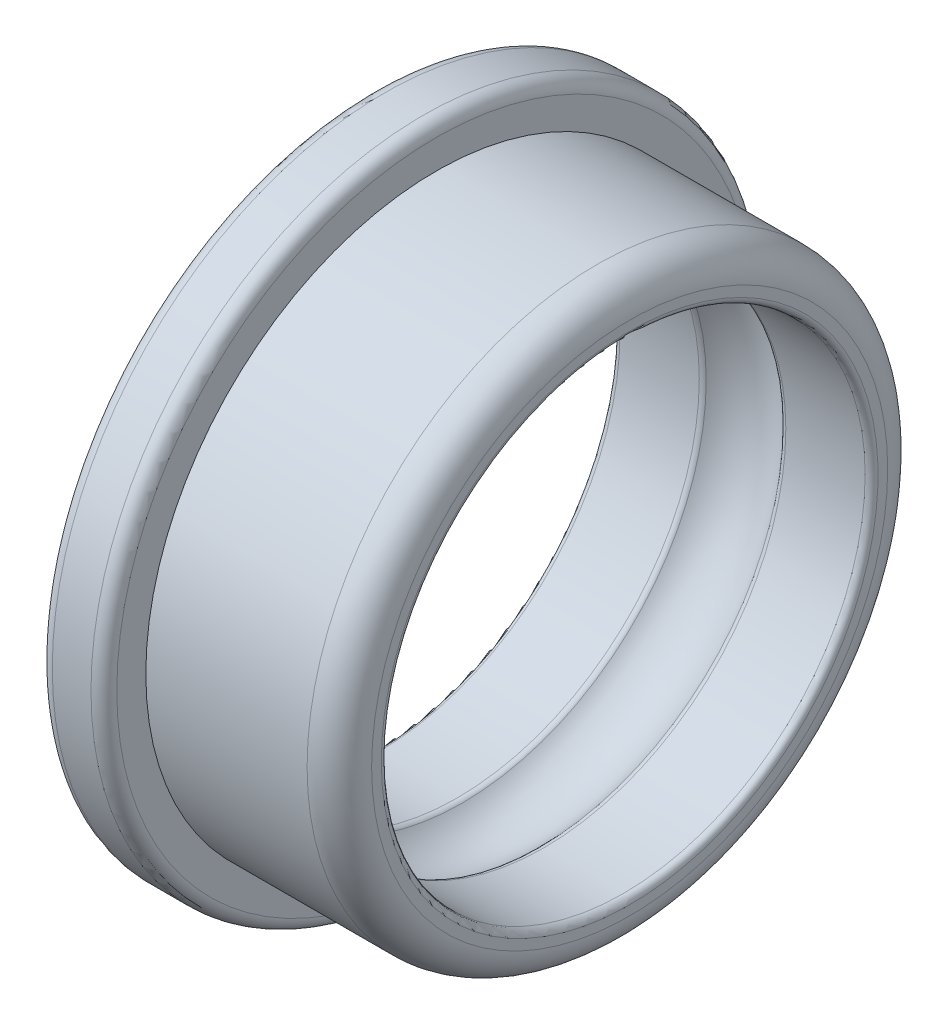
ISO-10303-21;
HEADER;
FILE_DESCRIPTION(('STEP AP214'),'2;1');
FILE_NAME('part.step','',(''),(''),'','','');
FILE_SCHEMA(('AUTOMOTIVE_DESIGN { 1 0 10303 214 1 1 1 1 }'));
ENDSEC;
DATA;
#1=APPLICATION_CONTEXT('core data for automotive mechanical design processes');
#2=APPLICATION_PROTOCOL_DEFINITION('international standard','automotive_design',2000,#1);
#3=PRODUCT_CONTEXT('',#1,'mechanical');
#4=PRODUCT('Part','Part','',(#3));
#5=PRODUCT_RELATED_PRODUCT_CATEGORY('part','',(#4));
#6=PRODUCT_DEFINITION_FORMATION('','',#4);
#7=PRODUCT_DEFINITION_CONTEXT('part definition',#1,'design');
#8=PRODUCT_DEFINITION('design','',#6,#7);
#9=PRODUCT_DEFINITION_SHAPE('','',#8);
#10=(LENGTH_UNIT() NAMED_UNIT(*) SI_UNIT(.MILLI.,.METRE.));
#11=(NAMED_UNIT(*) PLANE_ANGLE_UNIT() SI_UNIT($,.RADIAN.));
#12=(NAMED_UNIT(*) SI_UNIT($,.STERADIAN.) SOLID_ANGLE_UNIT());
#13=UNCERTAINTY_MEASURE_WITH_UNIT(LENGTH_MEASURE(1.E-05),#10,'distance_accuracy_value','');
#14=(GEOMETRIC_REPRESENTATION_CONTEXT(3) GLOBAL_UNCERTAINTY_ASSIGNED_CONTEXT((#13)) GLOBAL_UNIT_ASSIGNED_CONTEXT((#10,
#11,#12)) REPRESENTATION_CONTEXT('',''));
#15=CARTESIAN_POINT('',(0.,0.,0.));
#16=DIRECTION('',(0.,0.,1.));
#17=DIRECTION('',(1.,0.,0.));
#18=AXIS2_PLACEMENT_3D('',#15,#16,#17);
#19=CARTESIAN_POINT('',(-9.85856409676789,0.,0.));
#20=DIRECTION('',(-1.,0.,0.));
#21=DIRECTION('',(0.,0.,1.));
#22=AXIS2_PLACEMENT_3D('',#19,#20,#21);
#23=CYLINDRICAL_SURFACE('',#22,3.75);
#24=CARTESIAN_POINT('',(-2.51823685224447,0.,0.));
#25=DIRECTION('',(1.,0.,0.));
#26=DIRECTION('',(0.,0.,-1.));
#27=AXIS2_PLACEMENT_3D('',#24,#25,#26);
#28=CIRCLE('',#27,3.75);
#29=CARTESIAN_POINT('',(-2.51823685224447,0.,-3.75));
#30=VERTEX_POINT('',#29);
#31=EDGE_CURVE('E77',#30,#30,#28,.F.);
#32=ORIENTED_EDGE('',*,*,#31,.T.);
#33=EDGE_LOOP('',(#32));
#34=FACE_BOUND('',#33,.T.);
#35=CARTESIAN_POINT('',(-1.2890572454944,0.,0.));
#36=DIRECTION('',(-1.,0.,0.));
#37=DIRECTION('',(0.,0.,1.));
#38=AXIS2_PLACEMENT_3D('',#35,#36,#37);
#39=CIRCLE('',#38,3.75);
#40=CARTESIAN_POINT('',(-1.2890572454944,0.,3.75));
#41=VERTEX_POINT('',#40);
#42=EDGE_CURVE('E80',#41,#41,#39,.F.);
#43=ORIENTED_EDGE('',*,*,#42,.T.);
#44=EDGE_LOOP('',(#43));
#45=FACE_BOUND('',#44,.T.);
#46=ADVANCED_FACE('F39',(#34,#45),#23,.F.);
#47=CARTESIAN_POINT('',(-3.1890572454944,0.,0.));
#48=DIRECTION('',(-1.,0.,0.));
#49=DIRECTION('',(0.,0.,1.));
#50=AXIS2_PLACEMENT_3D('',#47,#48,#49);
#51=TOROIDAL_SURFACE('',#50,3.25,0.8);
#52=CARTESIAN_POINT('',(-2.59277245149445,0.,0.));
#53=DIRECTION('',(-1.,0.,0.));
#54=DIRECTION('',(0.,0.,1.));
#55=AXIS2_PLACEMENT_3D('',#52,#53,#54);
#56=CIRCLE('',#55,3.78333333333334);
#57=CARTESIAN_POINT('',(-2.59277245149445,0.,3.78333333333334));
#58=VERTEX_POINT('',#57);
#59=EDGE_CURVE('E71',#58,#58,#56,.F.);
#60=ORIENTED_EDGE('',*,*,#59,.T.);
#61=EDGE_LOOP('',(#60));
#62=FACE_BOUND('',#61,.T.);
#63=CARTESIAN_POINT('',(-3.78534203949435,0.,0.));
#64=DIRECTION('',(1.,0.,0.));
#65=DIRECTION('',(0.,0.,-1.));
#66=AXIS2_PLACEMENT_3D('',#63,#64,#65);
#67=CIRCLE('',#66,3.78333333333334);
#68=CARTESIAN_POINT('',(-3.78534203949435,0.,-3.78333333333334));
#69=VERTEX_POINT('',#68);
#70=EDGE_CURVE('E74',#69,#69,#67,.F.);
#71=ORIENTED_EDGE('',*,*,#70,.T.);
#72=EDGE_LOOP('',(#71));
#73=FACE_BOUND('',#72,.T.);
#74=ADVANCED_FACE('F110',(#62,#73),#51,.F.);
#75=CARTESIAN_POINT('',(-9.85856409676789,0.,0.));
#76=DIRECTION('',(-1.,0.,0.));
#77=DIRECTION('',(0.,0.,1.));
#78=AXIS2_PLACEMENT_3D('',#75,#76,#77);
#79=CYLINDRICAL_SURFACE('',#78,3.75);
#80=CARTESIAN_POINT('',(-5.0890572454944,0.,0.));
#81=DIRECTION('',(1.,0.,0.));
#82=DIRECTION('',(0.,0.,-1.));
#83=AXIS2_PLACEMENT_3D('',#80,#81,#82);
#84=CIRCLE('',#83,3.75);
#85=CARTESIAN_POINT('',(-5.0890572454944,0.,-3.75));
#86=VERTEX_POINT('',#85);
#87=EDGE_CURVE('E62',#86,#86,#84,.F.);
#88=ORIENTED_EDGE('',*,*,#87,.T.);
#89=EDGE_LOOP('',(#88));
#90=FACE_BOUND('',#89,.T.);
#91=CARTESIAN_POINT('',(-3.85987763874434,0.,0.));
#92=DIRECTION('',(1.,0.,0.));
#93=DIRECTION('',(0.,0.,-1.));
#94=AXIS2_PLACEMENT_3D('',#91,#92,#93);
#95=CIRCLE('',#94,3.75);
#96=CARTESIAN_POINT('',(-3.85987763874434,0.,-3.75));
#97=VERTEX_POINT('',#96);
#98=EDGE_CURVE('E65',#97,#97,#95,.T.);
#99=ORIENTED_EDGE('',*,*,#98,.T.);
#100=EDGE_LOOP('',(#99));
#101=FACE_BOUND('',#100,.T.);
#102=ADVANCED_FACE('F116',(#90,#101),#79,.F.);
#103=CARTESIAN_POINT('',(-5.1890572454944,4.50000000000001,0.));
#104=DIRECTION('',(1.,0.,0.));
#105=DIRECTION('',(0.,0.,-1.));
#106=AXIS2_PLACEMENT_3D('',#103,#104,#105);
#107=PLANE('',#106);
#108=CARTESIAN_POINT('',(-5.1890572454944,0.,0.));
#109=DIRECTION('',(1.,0.,0.));
#110=DIRECTION('',(0.,0.,-1.));
#111=AXIS2_PLACEMENT_3D('',#108,#109,#110);
#112=CIRCLE('',#111,4.95);
#113=CARTESIAN_POINT('',(-5.1890572454944,0.,-4.95));
#114=VERTEX_POINT('',#113);
#115=EDGE_CURVE('E10',#114,#114,#112,.F.);
#116=ORIENTED_EDGE('',*,*,#115,.T.);
#117=EDGE_LOOP('',(#116));
#118=FACE_BOUND('',#117,.T.);
#119=CARTESIAN_POINT('',(-5.1890572454944,0.,0.));
#120=DIRECTION('',(1.,0.,0.));
#121=DIRECTION('',(0.,0.,-1.));
#122=AXIS2_PLACEMENT_3D('',#119,#120,#121);
#123=CIRCLE('',#122,3.85);
#124=CARTESIAN_POINT('',(-5.1890572454944,0.,-3.85));
#125=VERTEX_POINT('',#124);
#126=EDGE_CURVE('E59',#125,#125,#123,.T.);
#127=ORIENTED_EDGE('',*,*,#126,.T.);
#128=EDGE_LOOP('',(#127));
#129=FACE_BOUND('',#128,.T.);
#130=ADVANCED_FACE('F152',(#118,#129),#107,.F.);
#131=CARTESIAN_POINT('',(-9.85856409676789,0.,0.));
#132=DIRECTION('',(-1.,0.,0.));
#133=DIRECTION('',(0.,0.,1.));
#134=AXIS2_PLACEMENT_3D('',#131,#132,#133);
#135=CYLINDRICAL_SURFACE('',#134,5.15);
#136=CARTESIAN_POINT('',(-4.3890572454944,0.,0.));
#137=DIRECTION('',(-1.,0.,0.));
#138=DIRECTION('',(0.,0.,1.));
#139=AXIS2_PLACEMENT_3D('',#136,#137,#138);
#140=CIRCLE('',#139,5.15);
#141=CARTESIAN_POINT('',(-4.3890572454944,0.,5.15));
#142=VERTEX_POINT('',#141);
#143=EDGE_CURVE('E50',#142,#142,#140,.T.);
#144=ORIENTED_EDGE('',*,*,#143,.T.);
#145=EDGE_LOOP('',(#144));
#146=FACE_BOUND('',#145,.T.);
#147=CARTESIAN_POINT('',(-4.9890572454944,0.,0.));
#148=DIRECTION('',(1.,0.,0.));
#149=DIRECTION('',(0.,0.,-1.));
#150=AXIS2_PLACEMENT_3D('',#147,#148,#149);
#151=CIRCLE('',#150,5.15);
#152=CARTESIAN_POINT('',(-4.9890572454944,0.,-5.15));
#153=VERTEX_POINT('',#152);
#154=EDGE_CURVE('E54',#153,#153,#151,.T.);
#155=ORIENTED_EDGE('',*,*,#154,.T.);
#156=EDGE_LOOP('',(#155));
#157=FACE_BOUND('',#156,.T.);
#158=ADVANCED_FACE('F107',(#146,#157),#135,.T.);
#159=CARTESIAN_POINT('',(-4.1890572454944,5.15000000000001,0.));
#160=DIRECTION('',(-1.,0.,0.));
#161=DIRECTION('',(0.,0.,1.));
#162=AXIS2_PLACEMENT_3D('',#159,#160,#161);
#163=PLANE('',#162);
#164=CARTESIAN_POINT('',(-4.1890572454944,0.,0.));
#165=DIRECTION('',(-1.,0.,0.));
#166=DIRECTION('',(0.,0.,1.));
#167=AXIS2_PLACEMENT_3D('',#164,#165,#166);
#168=CIRCLE('',#167,4.95);
#169=CARTESIAN_POINT('',(-4.1890572454944,0.,4.95));
#170=VERTEX_POINT('',#169);
#171=EDGE_CURVE('E46',#170,#170,#168,.F.);
#172=ORIENTED_EDGE('',*,*,#171,.T.);
#173=EDGE_LOOP('',(#172));
#174=FACE_BOUND('',#173,.T.);
#175=CARTESIAN_POINT('',(-4.1890572454944,0.,0.));
#176=DIRECTION('',(-1.,0.,0.));
#177=DIRECTION('',(0.,0.,1.));
#178=AXIS2_PLACEMENT_3D('',#175,#176,#177);
#179=CIRCLE('',#178,4.5);
#180=CARTESIAN_POINT('',(-4.1890572454944,0.,4.5));
#181=VERTEX_POINT('',#180);
#182=EDGE_CURVE('E89',#181,#181,#179,.T.);
#183=ORIENTED_EDGE('',*,*,#182,.T.);
#184=EDGE_LOOP('',(#183));
#185=FACE_BOUND('',#184,.T.);
#186=ADVANCED_FACE('F93',(#174,#185),#163,.F.);
#187=CARTESIAN_POINT('',(-9.85856409676789,0.,0.));
#188=DIRECTION('',(-1.,0.,0.));
#189=DIRECTION('',(0.,0.,1.));
#190=AXIS2_PLACEMENT_3D('',#187,#188,#189);
#191=CYLINDRICAL_SURFACE('',#190,4.5);
#192=CARTESIAN_POINT('',(-1.6890572454944,0.,0.));
#193=DIRECTION('',(-1.,0.,0.));
#194=DIRECTION('',(0.,0.,1.));
#195=AXIS2_PLACEMENT_3D('',#192,#193,#194);
#196=CIRCLE('',#195,4.5);
#197=CARTESIAN_POINT('',(-1.6890572454944,0.,4.5));
#198=VERTEX_POINT('',#197);
#199=EDGE_CURVE('E86',#198,#198,#196,.T.);
#200=ORIENTED_EDGE('',*,*,#199,.T.);
#201=EDGE_LOOP('',(#200));
#202=FACE_BOUND('',#201,.T.);
#203=ORIENTED_EDGE('',*,*,#182,.F.);
#204=EDGE_LOOP('',(#203));
#205=FACE_BOUND('',#204,.T.);
#206=ADVANCED_FACE('F95',(#202,#205),#191,.T.);
#207=CARTESIAN_POINT('',(-1.1890572454944,4.50000000000001,0.));
#208=DIRECTION('',(-1.,0.,0.));
#209=DIRECTION('',(0.,0.,1.));
#210=AXIS2_PLACEMENT_3D('',#207,#208,#209);
#211=PLANE('',#210);
#212=CARTESIAN_POINT('',(-1.1890572454944,0.,0.));
#213=DIRECTION('',(-1.,0.,0.));
#214=DIRECTION('',(0.,0.,1.));
#215=AXIS2_PLACEMENT_3D('',#212,#213,#214);
#216=CIRCLE('',#215,3.85);
#217=CARTESIAN_POINT('',(-1.1890572454944,0.,3.85));
#218=VERTEX_POINT('',#217);
#219=EDGE_CURVE('E68',#218,#218,#216,.T.);
#220=ORIENTED_EDGE('',*,*,#219,.T.);
#221=EDGE_LOOP('',(#220));
#222=FACE_BOUND('',#221,.T.);
#223=CARTESIAN_POINT('',(-1.1890572454944,0.,0.));
#224=DIRECTION('',(-1.,0.,0.));
#225=DIRECTION('',(0.,0.,1.));
#226=AXIS2_PLACEMENT_3D('',#223,#224,#225);
#227=CIRCLE('',#226,4.);
#228=CARTESIAN_POINT('',(-1.1890572454944,0.,4.));
#229=VERTEX_POINT('',#228);
#230=EDGE_CURVE('E83',#229,#229,#227,.F.);
#231=ORIENTED_EDGE('',*,*,#230,.T.);
#232=EDGE_LOOP('',(#231));
#233=FACE_BOUND('',#232,.T.);
#234=ADVANCED_FACE('F97',(#222,#233),#211,.F.);
#235=CARTESIAN_POINT('',(-1.6890572454944,0.,0.));
#236=DIRECTION('',(-1.,0.,0.));
#237=DIRECTION('',(0.,0.,1.));
#238=AXIS2_PLACEMENT_3D('',#235,#236,#237);
#239=TOROIDAL_SURFACE('',#238,4.,0.5);
#240=ORIENTED_EDGE('',*,*,#230,.F.);
#241=EDGE_LOOP('',(#240));
#242=FACE_BOUND('',#241,.T.);
#243=ORIENTED_EDGE('',*,*,#199,.F.);
#244=EDGE_LOOP('',(#243));
#245=FACE_BOUND('',#244,.T.);
#246=ADVANCED_FACE('F104',(#242,#245),#239,.T.);
#247=CARTESIAN_POINT('',(-2.51823685224447,0.,0.));
#248=DIRECTION('',(1.,0.,0.));
#249=DIRECTION('',(0.,0.,-1.));
#250=AXIS2_PLACEMENT_3D('',#247,#248,#249);
#251=TOROIDAL_SURFACE('',#250,3.85,0.1);
#252=ORIENTED_EDGE('',*,*,#59,.F.);
#253=EDGE_LOOP('',(#252));
#254=FACE_BOUND('',#253,.T.);
#255=ORIENTED_EDGE('',*,*,#31,.F.);
#256=EDGE_LOOP('',(#255));
#257=FACE_BOUND('',#256,.T.);
#258=ADVANCED_FACE('F124',(#254,#257),#251,.T.);
#259=CARTESIAN_POINT('',(-1.2890572454944,0.,0.));
#260=DIRECTION('',(-1.,0.,0.));
#261=DIRECTION('',(0.,0.,1.));
#262=AXIS2_PLACEMENT_3D('',#259,#260,#261);
#263=TOROIDAL_SURFACE('',#262,3.85,0.1);
#264=ORIENTED_EDGE('',*,*,#42,.F.);
#265=EDGE_LOOP('',(#264));
#266=FACE_BOUND('',#265,.T.);
#267=ORIENTED_EDGE('',*,*,#219,.F.);
#268=EDGE_LOOP('',(#267));
#269=FACE_BOUND('',#268,.T.);
#270=ADVANCED_FACE('F128',(#266,#269),#263,.T.);
#271=CARTESIAN_POINT('',(-5.0890572454944,0.,0.));
#272=DIRECTION('',(1.,0.,0.));
#273=DIRECTION('',(0.,0.,-1.));
#274=AXIS2_PLACEMENT_3D('',#271,#272,#273);
#275=TOROIDAL_SURFACE('',#274,3.85,0.1);
#276=ORIENTED_EDGE('',*,*,#126,.F.);
#277=EDGE_LOOP('',(#276));
#278=FACE_BOUND('',#277,.T.);
#279=ORIENTED_EDGE('',*,*,#87,.F.);
#280=EDGE_LOOP('',(#279));
#281=FACE_BOUND('',#280,.T.);
#282=ADVANCED_FACE('F132',(#278,#281),#275,.T.);
#283=CARTESIAN_POINT('',(-3.85987763874434,0.,0.));
#284=DIRECTION('',(1.,0.,0.));
#285=DIRECTION('',(0.,0.,-1.));
#286=AXIS2_PLACEMENT_3D('',#283,#284,#285);
#287=TOROIDAL_SURFACE('',#286,3.85,0.1);
#288=ORIENTED_EDGE('',*,*,#98,.F.);
#289=EDGE_LOOP('',(#288));
#290=FACE_BOUND('',#289,.T.);
#291=ORIENTED_EDGE('',*,*,#70,.F.);
#292=EDGE_LOOP('',(#291));
#293=FACE_BOUND('',#292,.T.);
#294=ADVANCED_FACE('F136',(#290,#293),#287,.T.);
#295=CARTESIAN_POINT('',(-4.3890572454944,0.,0.));
#296=DIRECTION('',(-1.,0.,0.));
#297=DIRECTION('',(0.,0.,1.));
#298=AXIS2_PLACEMENT_3D('',#295,#296,#297);
#299=TOROIDAL_SURFACE('',#298,4.95,0.2);
#300=ORIENTED_EDGE('',*,*,#171,.F.);
#301=EDGE_LOOP('',(#300));
#302=FACE_BOUND('',#301,.T.);
#303=ORIENTED_EDGE('',*,*,#143,.F.);
#304=EDGE_LOOP('',(#303));
#305=FACE_BOUND('',#304,.T.);
#306=ADVANCED_FACE('F139',(#302,#305),#299,.T.);
#307=CARTESIAN_POINT('',(-4.9890572454944,0.,0.));
#308=DIRECTION('',(1.,0.,0.));
#309=DIRECTION('',(0.,0.,-1.));
#310=AXIS2_PLACEMENT_3D('',#307,#308,#309);
#311=TOROIDAL_SURFACE('',#310,4.95,0.2);
#312=ORIENTED_EDGE('',*,*,#154,.F.);
#313=EDGE_LOOP('',(#312));
#314=FACE_BOUND('',#313,.T.);
#315=ORIENTED_EDGE('',*,*,#115,.F.);
#316=EDGE_LOOP('',(#315));
#317=FACE_BOUND('',#316,.T.);
#318=ADVANCED_FACE('F41',(#314,#317),#311,.T.);
#319=CLOSED_SHELL('',(#46,#74,#102,#130,#158,#186,#206,#234,#246,#258,#270,#282,#294,#306,#318));
#320=MANIFOLD_SOLID_BREP('B2',#319);
#321=ADVANCED_BREP_SHAPE_REPRESENTATION('',(#18,#320),#14);
#322=SHAPE_DEFINITION_REPRESENTATION(#9,#321);
ENDSEC;
END-ISO-10303-21;
